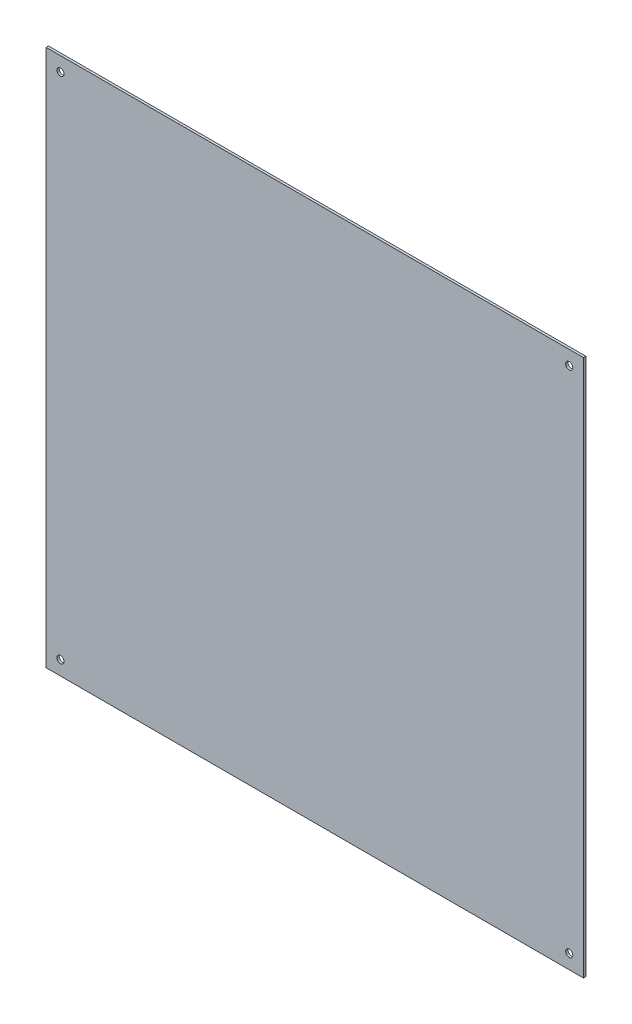
ISO-10303-21;
HEADER;
FILE_DESCRIPTION(('STEP AP214'),'2;1');
FILE_NAME('part.step','',(''),(''),'','','');
FILE_SCHEMA(('AUTOMOTIVE_DESIGN { 1 0 10303 214 1 1 1 1 }'));
ENDSEC;
DATA;
#1=APPLICATION_CONTEXT('core data for automotive mechanical design processes');
#2=APPLICATION_PROTOCOL_DEFINITION('international standard','automotive_design',2000,#1);
#3=PRODUCT_CONTEXT('',#1,'mechanical');
#4=PRODUCT('Part','Part','',(#3));
#5=PRODUCT_RELATED_PRODUCT_CATEGORY('part','',(#4));
#6=PRODUCT_DEFINITION_FORMATION('','',#4);
#7=PRODUCT_DEFINITION_CONTEXT('part definition',#1,'design');
#8=PRODUCT_DEFINITION('design','',#6,#7);
#9=PRODUCT_DEFINITION_SHAPE('','',#8);
#10=(LENGTH_UNIT() NAMED_UNIT(*) SI_UNIT(.MILLI.,.METRE.));
#11=(NAMED_UNIT(*) PLANE_ANGLE_UNIT() SI_UNIT($,.RADIAN.));
#12=(NAMED_UNIT(*) SI_UNIT($,.STERADIAN.) SOLID_ANGLE_UNIT());
#13=UNCERTAINTY_MEASURE_WITH_UNIT(LENGTH_MEASURE(1.E-05),#10,'distance_accuracy_value','');
#14=(GEOMETRIC_REPRESENTATION_CONTEXT(3) GLOBAL_UNCERTAINTY_ASSIGNED_CONTEXT((#13)) GLOBAL_UNIT_ASSIGNED_CONTEXT((#10,
#11,#12)) REPRESENTATION_CONTEXT('',''));
#15=CARTESIAN_POINT('',(0.,0.,0.));
#16=DIRECTION('',(0.,0.,1.));
#17=DIRECTION('',(1.,0.,0.));
#18=AXIS2_PLACEMENT_3D('',#15,#16,#17);
#19=CARTESIAN_POINT('',(-113.15,0.,0.));
#20=DIRECTION('',(-1.,0.,0.));
#21=DIRECTION('',(0.,0.,1.));
#22=AXIS2_PLACEMENT_3D('',#19,#20,#21);
#23=PLANE('',#22);
#24=DIRECTION('',(0.,1.,0.));
#25=VECTOR('',#24,1.);
#26=CARTESIAN_POINT('',(-113.15,0.,0.));
#27=LINE('',#26,#25);
#28=CARTESIAN_POINT('',(-113.15,113.15,0.));
#29=VERTEX_POINT('',#28);
#30=CARTESIAN_POINT('',(-113.15,-113.15,0.));
#31=VERTEX_POINT('',#30);
#32=EDGE_CURVE('E99',#29,#31,#27,.F.);
#33=ORIENTED_EDGE('',*,*,#32,.T.);
#34=DIRECTION('',(0.,0.,1.));
#35=VECTOR('',#34,1.);
#36=CARTESIAN_POINT('',(-113.15,-113.15,0.));
#37=LINE('',#36,#35);
#38=CARTESIAN_POINT('',(-113.15,-113.15,1.));
#39=VERTEX_POINT('',#38);
#40=EDGE_CURVE('E83',#31,#39,#37,.T.);
#41=ORIENTED_EDGE('',*,*,#40,.T.);
#42=DIRECTION('',(0.,1.,0.));
#43=VECTOR('',#42,1.);
#44=CARTESIAN_POINT('',(-113.15,0.,1.));
#45=LINE('',#44,#43);
#46=CARTESIAN_POINT('',(-113.15,113.15,1.));
#47=VERTEX_POINT('',#46);
#48=EDGE_CURVE('E76',#39,#47,#45,.T.);
#49=ORIENTED_EDGE('',*,*,#48,.T.);
#50=DIRECTION('',(0.,0.,-1.));
#51=VECTOR('',#50,1.);
#52=CARTESIAN_POINT('',(-113.15,113.15,0.));
#53=LINE('',#52,#51);
#54=EDGE_CURVE('E56',#47,#29,#53,.T.);
#55=ORIENTED_EDGE('',*,*,#54,.T.);
#56=EDGE_LOOP('',(#33,#41,#49,#55));
#57=FACE_BOUND('',#56,.T.);
#58=ADVANCED_FACE('F17',(#57),#23,.T.);
#59=CARTESIAN_POINT('',(0.,-113.15,0.));
#60=DIRECTION('',(0.,1.,0.));
#61=DIRECTION('',(0.,0.,1.));
#62=AXIS2_PLACEMENT_3D('',#59,#60,#61);
#63=PLANE('',#62);
#64=DIRECTION('',(1.,0.,0.));
#65=VECTOR('',#64,1.);
#66=CARTESIAN_POINT('',(0.,-113.15,0.));
#67=LINE('',#66,#65);
#68=CARTESIAN_POINT('',(113.15,-113.15,0.));
#69=VERTEX_POINT('',#68);
#70=EDGE_CURVE('E110',#31,#69,#67,.T.);
#71=ORIENTED_EDGE('',*,*,#70,.T.);
#72=DIRECTION('',(0.,0.,-1.));
#73=VECTOR('',#72,1.);
#74=CARTESIAN_POINT('',(113.15,-113.15,0.));
#75=LINE('',#74,#73);
#76=CARTESIAN_POINT('',(113.15,-113.15,1.));
#77=VERTEX_POINT('',#76);
#78=EDGE_CURVE('E81',#69,#77,#75,.F.);
#79=ORIENTED_EDGE('',*,*,#78,.T.);
#80=DIRECTION('',(1.,0.,0.));
#81=VECTOR('',#80,1.);
#82=CARTESIAN_POINT('',(0.,-113.15,1.));
#83=LINE('',#82,#81);
#84=EDGE_CURVE('E74',#77,#39,#83,.F.);
#85=ORIENTED_EDGE('',*,*,#84,.T.);
#86=ORIENTED_EDGE('',*,*,#40,.F.);
#87=EDGE_LOOP('',(#71,#79,#85,#86));
#88=FACE_BOUND('',#87,.T.);
#89=ADVANCED_FACE('F119',(#88),#63,.F.);
#90=CARTESIAN_POINT('',(113.15,0.,0.));
#91=DIRECTION('',(1.,0.,0.));
#92=DIRECTION('',(0.,0.,-1.));
#93=AXIS2_PLACEMENT_3D('',#90,#91,#92);
#94=PLANE('',#93);
#95=DIRECTION('',(0.,1.,0.));
#96=VECTOR('',#95,1.);
#97=CARTESIAN_POINT('',(113.15,0.,0.));
#98=LINE('',#97,#96);
#99=CARTESIAN_POINT('',(113.15,113.15,0.));
#100=VERTEX_POINT('',#99);
#101=EDGE_CURVE('E35',#69,#100,#98,.T.);
#102=ORIENTED_EDGE('',*,*,#101,.T.);
#103=DIRECTION('',(0.,0.,-1.));
#104=VECTOR('',#103,1.);
#105=CARTESIAN_POINT('',(113.15,113.15,0.));
#106=LINE('',#105,#104);
#107=CARTESIAN_POINT('',(113.15,113.15,1.));
#108=VERTEX_POINT('',#107);
#109=EDGE_CURVE('E59',#100,#108,#106,.F.);
#110=ORIENTED_EDGE('',*,*,#109,.T.);
#111=DIRECTION('',(0.,1.,0.));
#112=VECTOR('',#111,1.);
#113=CARTESIAN_POINT('',(113.15,0.,1.));
#114=LINE('',#113,#112);
#115=EDGE_CURVE('E62',#108,#77,#114,.F.);
#116=ORIENTED_EDGE('',*,*,#115,.T.);
#117=ORIENTED_EDGE('',*,*,#78,.F.);
#118=EDGE_LOOP('',(#102,#110,#116,#117));
#119=FACE_BOUND('',#118,.T.);
#120=ADVANCED_FACE('F60',(#119),#94,.T.);
#121=CARTESIAN_POINT('',(0.,113.15,0.));
#122=DIRECTION('',(0.,-1.,0.));
#123=DIRECTION('',(0.,0.,-1.));
#124=AXIS2_PLACEMENT_3D('',#121,#122,#123);
#125=PLANE('',#124);
#126=DIRECTION('',(1.,0.,0.));
#127=VECTOR('',#126,1.);
#128=CARTESIAN_POINT('',(0.,113.15,0.));
#129=LINE('',#128,#127);
#130=EDGE_CURVE('E96',#100,#29,#129,.F.);
#131=ORIENTED_EDGE('',*,*,#130,.T.);
#132=ORIENTED_EDGE('',*,*,#54,.F.);
#133=DIRECTION('',(1.,0.,0.));
#134=VECTOR('',#133,1.);
#135=CARTESIAN_POINT('',(0.,113.15,1.));
#136=LINE('',#135,#134);
#137=EDGE_CURVE('E65',#47,#108,#136,.T.);
#138=ORIENTED_EDGE('',*,*,#137,.T.);
#139=ORIENTED_EDGE('',*,*,#109,.F.);
#140=EDGE_LOOP('',(#131,#132,#138,#139));
#141=FACE_BOUND('',#140,.T.);
#142=ADVANCED_FACE('F68',(#141),#125,.F.);
#143=CARTESIAN_POINT('',(107.15,-107.15,1.));
#144=DIRECTION('',(0.,0.,-1.));
#145=DIRECTION('',(-1.,0.,0.));
#146=AXIS2_PLACEMENT_3D('',#143,#144,#145);
#147=CYLINDRICAL_SURFACE('',#146,1.49999995861775);
#148=CARTESIAN_POINT('',(107.15,-107.15,0.));
#149=DIRECTION('',(0.,0.,-1.));
#150=DIRECTION('',(-1.,0.,0.));
#151=AXIS2_PLACEMENT_3D('',#148,#149,#150);
#152=CIRCLE('',#151,1.49999995861775);
#153=CARTESIAN_POINT('',(105.650000041382,-107.15,0.));
#154=VERTEX_POINT('',#153);
#155=EDGE_CURVE('E93',#154,#154,#152,.T.);
#156=ORIENTED_EDGE('',*,*,#155,.T.);
#157=EDGE_LOOP('',(#156));
#158=FACE_BOUND('',#157,.T.);
#159=CARTESIAN_POINT('',(107.15,-107.15,1.));
#160=DIRECTION('',(0.,0.,-1.));
#161=DIRECTION('',(-1.,0.,0.));
#162=AXIS2_PLACEMENT_3D('',#159,#160,#161);
#163=CIRCLE('',#162,1.49999995861778);
#164=CARTESIAN_POINT('',(105.650000041382,-107.15,1.));
#165=VERTEX_POINT('',#164);
#166=EDGE_CURVE('E20',#165,#165,#163,.F.);
#167=ORIENTED_EDGE('',*,*,#166,.T.);
#168=EDGE_LOOP('',(#167));
#169=FACE_BOUND('',#168,.T.);
#170=ADVANCED_FACE('F149',(#158,#169),#147,.F.);
#171=CARTESIAN_POINT('',(-107.15,-107.15,1.));
#172=DIRECTION('',(0.,0.,-1.));
#173=DIRECTION('',(-1.,0.,0.));
#174=AXIS2_PLACEMENT_3D('',#171,#172,#173);
#175=CYLINDRICAL_SURFACE('',#174,1.49999995861775);
#176=CARTESIAN_POINT('',(-107.15,-107.15,0.));
#177=DIRECTION('',(0.,0.,-1.));
#178=DIRECTION('',(-1.,0.,0.));
#179=AXIS2_PLACEMENT_3D('',#176,#177,#178);
#180=CIRCLE('',#179,1.49999995861775);
#181=CARTESIAN_POINT('',(-108.649999958618,-107.15,0.));
#182=VERTEX_POINT('',#181);
#183=EDGE_CURVE('E90',#182,#182,#180,.T.);
#184=ORIENTED_EDGE('',*,*,#183,.T.);
#185=EDGE_LOOP('',(#184));
#186=FACE_BOUND('',#185,.T.);
#187=CARTESIAN_POINT('',(-107.15,-107.15,1.));
#188=DIRECTION('',(0.,0.,-1.));
#189=DIRECTION('',(-1.,0.,0.));
#190=AXIS2_PLACEMENT_3D('',#187,#188,#189);
#191=CIRCLE('',#190,1.49999995861778);
#192=CARTESIAN_POINT('',(-108.649999958618,-107.15,1.));
#193=VERTEX_POINT('',#192);
#194=EDGE_CURVE('E100',#193,#193,#191,.F.);
#195=ORIENTED_EDGE('',*,*,#194,.T.);
#196=EDGE_LOOP('',(#195));
#197=FACE_BOUND('',#196,.T.);
#198=ADVANCED_FACE('F145',(#186,#197),#175,.F.);
#199=CARTESIAN_POINT('',(107.15,107.15,1.));
#200=DIRECTION('',(0.,0.,-1.));
#201=DIRECTION('',(-1.,0.,0.));
#202=AXIS2_PLACEMENT_3D('',#199,#200,#201);
#203=CYLINDRICAL_SURFACE('',#202,1.49999995861775);
#204=CARTESIAN_POINT('',(107.15,107.15,0.));
#205=DIRECTION('',(0.,0.,-1.));
#206=DIRECTION('',(-1.,0.,0.));
#207=AXIS2_PLACEMENT_3D('',#204,#205,#206);
#208=CIRCLE('',#207,1.49999995861775);
#209=CARTESIAN_POINT('',(105.650000041382,107.15,0.));
#210=VERTEX_POINT('',#209);
#211=EDGE_CURVE('E87',#210,#210,#208,.T.);
#212=ORIENTED_EDGE('',*,*,#211,.T.);
#213=EDGE_LOOP('',(#212));
#214=FACE_BOUND('',#213,.T.);
#215=CARTESIAN_POINT('',(107.15,107.15,1.));
#216=DIRECTION('',(0.,0.,-1.));
#217=DIRECTION('',(-1.,0.,0.));
#218=AXIS2_PLACEMENT_3D('',#215,#216,#217);
#219=CIRCLE('',#218,1.49999995861778);
#220=CARTESIAN_POINT('',(105.650000041382,107.15,1.));
#221=VERTEX_POINT('',#220);
#222=EDGE_CURVE('E97',#221,#221,#219,.F.);
#223=ORIENTED_EDGE('',*,*,#222,.T.);
#224=EDGE_LOOP('',(#223));
#225=FACE_BOUND('',#224,.T.);
#226=ADVANCED_FACE('F141',(#214,#225),#203,.F.);
#227=CARTESIAN_POINT('',(0.,0.,1.));
#228=DIRECTION('',(0.,0.,1.));
#229=DIRECTION('',(1.,0.,0.));
#230=AXIS2_PLACEMENT_3D('',#227,#228,#229);
#231=PLANE('',#230);
#232=ORIENTED_EDGE('',*,*,#222,.F.);
#233=EDGE_LOOP('',(#232));
#234=FACE_BOUND('',#233,.T.);
#235=ORIENTED_EDGE('',*,*,#194,.F.);
#236=EDGE_LOOP('',(#235));
#237=FACE_BOUND('',#236,.T.);
#238=ORIENTED_EDGE('',*,*,#166,.F.);
#239=EDGE_LOOP('',(#238));
#240=FACE_BOUND('',#239,.T.);
#241=CARTESIAN_POINT('',(-107.15,107.15,1.));
#242=DIRECTION('',(0.,0.,-1.));
#243=DIRECTION('',(-1.,0.,0.));
#244=AXIS2_PLACEMENT_3D('',#241,#242,#243);
#245=CIRCLE('',#244,1.49999995861775);
#246=CARTESIAN_POINT('',(-108.649999958618,107.15,1.));
#247=VERTEX_POINT('',#246);
#248=EDGE_CURVE('E26',#247,#247,#245,.T.);
#249=ORIENTED_EDGE('',*,*,#248,.T.);
#250=EDGE_LOOP('',(#249));
#251=FACE_BOUND('',#250,.T.);
#252=ORIENTED_EDGE('',*,*,#84,.F.);
#253=ORIENTED_EDGE('',*,*,#115,.F.);
#254=ORIENTED_EDGE('',*,*,#137,.F.);
#255=ORIENTED_EDGE('',*,*,#48,.F.);
#256=EDGE_LOOP('',(#252,#253,#254,#255));
#257=FACE_BOUND('',#256,.T.);
#258=ADVANCED_FACE('F72',(#234,#237,#240,#251,#257),#231,.T.);
#259=CARTESIAN_POINT('',(0.,0.,0.));
#260=DIRECTION('',(0.,0.,1.));
#261=DIRECTION('',(1.,0.,0.));
#262=AXIS2_PLACEMENT_3D('',#259,#260,#261);
#263=PLANE('',#262);
#264=ORIENTED_EDGE('',*,*,#211,.F.);
#265=EDGE_LOOP('',(#264));
#266=FACE_BOUND('',#265,.T.);
#267=ORIENTED_EDGE('',*,*,#183,.F.);
#268=EDGE_LOOP('',(#267));
#269=FACE_BOUND('',#268,.T.);
#270=ORIENTED_EDGE('',*,*,#155,.F.);
#271=EDGE_LOOP('',(#270));
#272=FACE_BOUND('',#271,.T.);
#273=CARTESIAN_POINT('',(-107.15,107.15,0.));
#274=DIRECTION('',(0.,0.,-1.));
#275=DIRECTION('',(-1.,0.,0.));
#276=AXIS2_PLACEMENT_3D('',#273,#274,#275);
#277=CIRCLE('',#276,1.49999995861775);
#278=CARTESIAN_POINT('',(-108.649999958618,107.15,0.));
#279=VERTEX_POINT('',#278);
#280=EDGE_CURVE('E11',#279,#279,#277,.F.);
#281=ORIENTED_EDGE('',*,*,#280,.T.);
#282=EDGE_LOOP('',(#281));
#283=FACE_BOUND('',#282,.T.);
#284=ORIENTED_EDGE('',*,*,#101,.F.);
#285=ORIENTED_EDGE('',*,*,#70,.F.);
#286=ORIENTED_EDGE('',*,*,#32,.F.);
#287=ORIENTED_EDGE('',*,*,#130,.F.);
#288=EDGE_LOOP('',(#284,#285,#286,#287));
#289=FACE_BOUND('',#288,.T.);
#290=ADVANCED_FACE('F116',(#266,#269,#272,#283,#289),#263,.F.);
#291=CARTESIAN_POINT('',(-107.15,107.15,1.));
#292=DIRECTION('',(0.,0.,-1.));
#293=DIRECTION('',(-1.,0.,0.));
#294=AXIS2_PLACEMENT_3D('',#291,#292,#293);
#295=CYLINDRICAL_SURFACE('',#294,1.49999995861775);
#296=ORIENTED_EDGE('',*,*,#280,.F.);
#297=EDGE_LOOP('',(#296));
#298=FACE_BOUND('',#297,.T.);
#299=ORIENTED_EDGE('',*,*,#248,.F.);
#300=EDGE_LOOP('',(#299));
#301=FACE_BOUND('',#300,.T.);
#302=ADVANCED_FACE('F127',(#298,#301),#295,.F.);
#303=CLOSED_SHELL('',(#58,#89,#120,#142,#170,#198,#226,#258,#290,#302));
#304=MANIFOLD_SOLID_BREP('B1',#303);
#305=ADVANCED_BREP_SHAPE_REPRESENTATION('',(#18,#304),#14);
#306=SHAPE_DEFINITION_REPRESENTATION(#9,#305);
ENDSEC;
END-ISO-10303-21;
